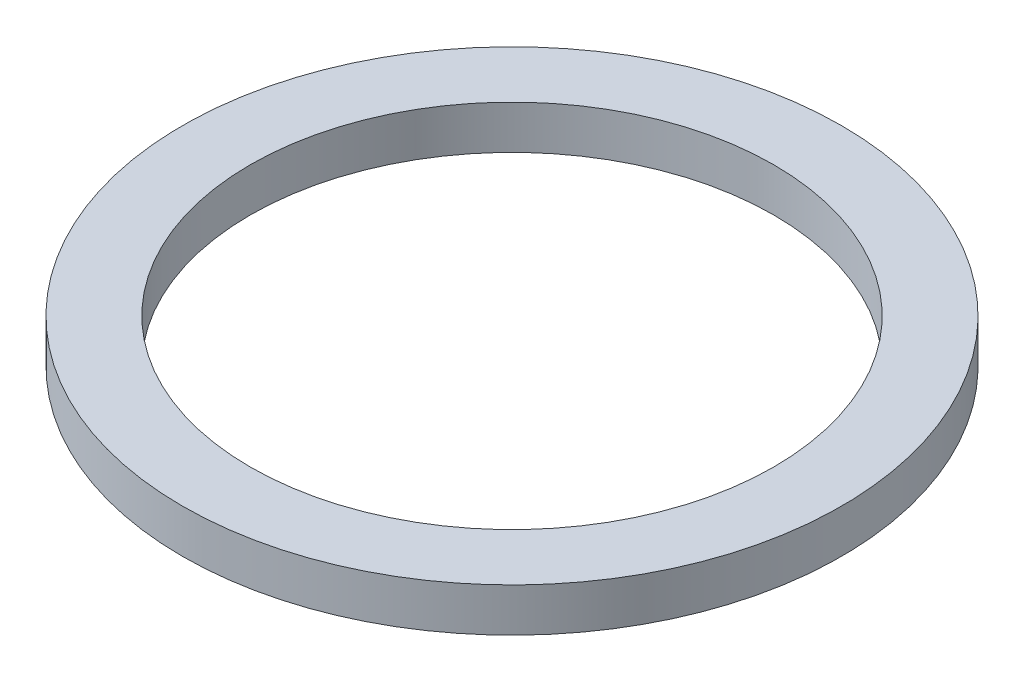
ISO-10303-21;
HEADER;
FILE_DESCRIPTION(('STEP AP214'),'2;1');
FILE_NAME('part.step','',(''),(''),'','','');
FILE_SCHEMA(('AUTOMOTIVE_DESIGN { 1 0 10303 214 1 1 1 1 }'));
ENDSEC;
DATA;
#1=APPLICATION_CONTEXT('core data for automotive mechanical design processes');
#2=APPLICATION_PROTOCOL_DEFINITION('international standard','automotive_design',2000,#1);
#3=PRODUCT_CONTEXT('',#1,'mechanical');
#4=PRODUCT('Part','Part','',(#3));
#5=PRODUCT_RELATED_PRODUCT_CATEGORY('part','',(#4));
#6=PRODUCT_DEFINITION_FORMATION('','',#4);
#7=PRODUCT_DEFINITION_CONTEXT('part definition',#1,'design');
#8=PRODUCT_DEFINITION('design','',#6,#7);
#9=PRODUCT_DEFINITION_SHAPE('','',#8);
#10=(LENGTH_UNIT() NAMED_UNIT(*) SI_UNIT(.MILLI.,.METRE.));
#11=(NAMED_UNIT(*) PLANE_ANGLE_UNIT() SI_UNIT($,.RADIAN.));
#12=(NAMED_UNIT(*) SI_UNIT($,.STERADIAN.) SOLID_ANGLE_UNIT());
#13=UNCERTAINTY_MEASURE_WITH_UNIT(LENGTH_MEASURE(1.E-05),#10,'distance_accuracy_value','');
#14=(GEOMETRIC_REPRESENTATION_CONTEXT(3) GLOBAL_UNCERTAINTY_ASSIGNED_CONTEXT((#13)) GLOBAL_UNIT_ASSIGNED_CONTEXT((#10,
#11,#12)) REPRESENTATION_CONTEXT('',''));
#15=CARTESIAN_POINT('',(0.,0.,0.));
#16=DIRECTION('',(0.,0.,1.));
#17=DIRECTION('',(1.,0.,0.));
#18=AXIS2_PLACEMENT_3D('',#15,#16,#17);
#19=CARTESIAN_POINT('',(0.,1.778,0.));
#20=DIRECTION('',(0.,-1.,0.));
#21=DIRECTION('',(0.,0.,-1.));
#22=AXIS2_PLACEMENT_3D('',#19,#20,#21);
#23=CYLINDRICAL_SURFACE('',#22,13.462);
#24=CARTESIAN_POINT('',(0.,1.778,0.));
#25=DIRECTION('',(0.,1.,0.));
#26=DIRECTION('',(0.,0.,1.));
#27=AXIS2_PLACEMENT_3D('',#24,#25,#26);
#28=CIRCLE('',#27,13.462);
#29=CARTESIAN_POINT('',(0.,1.778,13.462));
#30=VERTEX_POINT('',#29);
#31=EDGE_CURVE('E10',#30,#30,#28,.T.);
#32=ORIENTED_EDGE('',*,*,#31,.F.);
#33=EDGE_LOOP('',(#32));
#34=FACE_BOUND('',#33,.T.);
#35=CARTESIAN_POINT('',(0.,0.,0.));
#36=DIRECTION('',(0.,1.,0.));
#37=DIRECTION('',(0.,0.,1.));
#38=AXIS2_PLACEMENT_3D('',#35,#36,#37);
#39=CIRCLE('',#38,13.462);
#40=CARTESIAN_POINT('',(0.,0.,13.462));
#41=VERTEX_POINT('',#40);
#42=EDGE_CURVE('E34',#41,#41,#39,.T.);
#43=ORIENTED_EDGE('',*,*,#42,.T.);
#44=EDGE_LOOP('',(#43));
#45=FACE_BOUND('',#44,.T.);
#46=ADVANCED_FACE('F31',(#34,#45),#23,.T.);
#47=CARTESIAN_POINT('',(0.,1.778,0.));
#48=DIRECTION('',(0.,1.,0.));
#49=DIRECTION('',(0.,0.,1.));
#50=AXIS2_PLACEMENT_3D('',#47,#48,#49);
#51=PLANE('',#50);
#52=CARTESIAN_POINT('',(0.,1.778,0.));
#53=DIRECTION('',(0.,1.,0.));
#54=DIRECTION('',(0.,0.,1.));
#55=AXIS2_PLACEMENT_3D('',#52,#53,#54);
#56=CIRCLE('',#55,10.6934);
#57=CARTESIAN_POINT('',(0.,1.778,10.6934));
#58=VERTEX_POINT('',#57);
#59=EDGE_CURVE('E43',#58,#58,#56,.T.);
#60=ORIENTED_EDGE('',*,*,#59,.F.);
#61=EDGE_LOOP('',(#60));
#62=FACE_BOUND('',#61,.T.);
#63=ORIENTED_EDGE('',*,*,#31,.T.);
#64=EDGE_LOOP('',(#63));
#65=FACE_BOUND('',#64,.T.);
#66=ADVANCED_FACE('F58',(#62,#65),#51,.T.);
#67=CARTESIAN_POINT('',(0.,0.,0.));
#68=DIRECTION('',(0.,1.,0.));
#69=DIRECTION('',(0.,0.,1.));
#70=AXIS2_PLACEMENT_3D('',#67,#68,#69);
#71=PLANE('',#70);
#72=CARTESIAN_POINT('',(0.,0.,0.));
#73=DIRECTION('',(0.,1.,0.));
#74=DIRECTION('',(0.,0.,1.));
#75=AXIS2_PLACEMENT_3D('',#72,#73,#74);
#76=CIRCLE('',#75,10.6934);
#77=CARTESIAN_POINT('',(0.,0.,10.6934));
#78=VERTEX_POINT('',#77);
#79=EDGE_CURVE('E41',#78,#78,#76,.T.);
#80=ORIENTED_EDGE('',*,*,#79,.T.);
#81=EDGE_LOOP('',(#80));
#82=FACE_BOUND('',#81,.T.);
#83=ORIENTED_EDGE('',*,*,#42,.F.);
#84=EDGE_LOOP('',(#83));
#85=FACE_BOUND('',#84,.T.);
#86=ADVANCED_FACE('F49',(#82,#85),#71,.F.);
#87=CARTESIAN_POINT('',(0.,0.,0.));
#88=DIRECTION('',(0.,1.,0.));
#89=DIRECTION('',(0.,0.,1.));
#90=AXIS2_PLACEMENT_3D('',#87,#88,#89);
#91=CYLINDRICAL_SURFACE('',#90,10.6934);
#92=ORIENTED_EDGE('',*,*,#79,.F.);
#93=EDGE_LOOP('',(#92));
#94=FACE_BOUND('',#93,.T.);
#95=ORIENTED_EDGE('',*,*,#59,.T.);
#96=EDGE_LOOP('',(#95));
#97=FACE_BOUND('',#96,.T.);
#98=ADVANCED_FACE('F52',(#94,#97),#91,.F.);
#99=CLOSED_SHELL('',(#46,#66,#86,#98));
#100=MANIFOLD_SOLID_BREP('B2',#99);
#101=ADVANCED_BREP_SHAPE_REPRESENTATION('',(#18,#100),#14);
#102=SHAPE_DEFINITION_REPRESENTATION(#9,#101);
ENDSEC;
END-ISO-10303-21;
